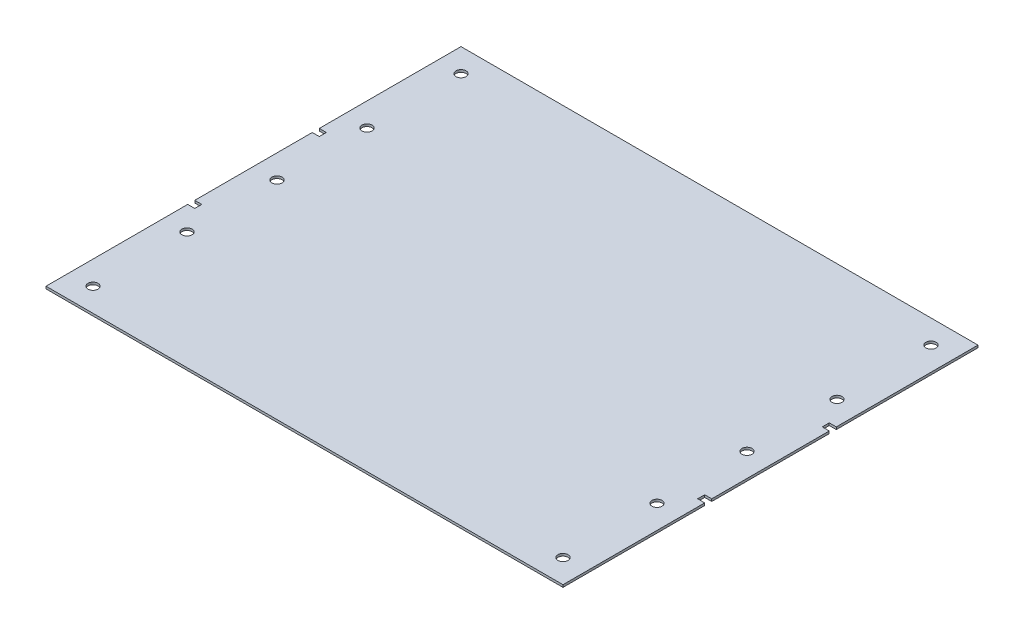
ISO-10303-21;
HEADER;
FILE_DESCRIPTION(('STEP AP214'),'2;1');
FILE_NAME('part.step','',(''),(''),'','','');
FILE_SCHEMA(('AUTOMOTIVE_DESIGN { 1 0 10303 214 1 1 1 1 }'));
ENDSEC;
DATA;
#1=APPLICATION_CONTEXT('core data for automotive mechanical design processes');
#2=APPLICATION_PROTOCOL_DEFINITION('international standard','automotive_design',2000,#1);
#3=PRODUCT_CONTEXT('',#1,'mechanical');
#4=PRODUCT('Part','Part','',(#3));
#5=PRODUCT_RELATED_PRODUCT_CATEGORY('part','',(#4));
#6=PRODUCT_DEFINITION_FORMATION('','',#4);
#7=PRODUCT_DEFINITION_CONTEXT('part definition',#1,'design');
#8=PRODUCT_DEFINITION('design','',#6,#7);
#9=PRODUCT_DEFINITION_SHAPE('','',#8);
#10=(LENGTH_UNIT() NAMED_UNIT(*) SI_UNIT(.MILLI.,.METRE.));
#11=(NAMED_UNIT(*) PLANE_ANGLE_UNIT() SI_UNIT($,.RADIAN.));
#12=(NAMED_UNIT(*) SI_UNIT($,.STERADIAN.) SOLID_ANGLE_UNIT());
#13=UNCERTAINTY_MEASURE_WITH_UNIT(LENGTH_MEASURE(1.E-05),#10,'distance_accuracy_value','');
#14=(GEOMETRIC_REPRESENTATION_CONTEXT(3) GLOBAL_UNCERTAINTY_ASSIGNED_CONTEXT((#13)) GLOBAL_UNIT_ASSIGNED_CONTEXT((#10,
#11,#12)) REPRESENTATION_CONTEXT('',''));
#15=CARTESIAN_POINT('',(0.,0.,0.));
#16=DIRECTION('',(0.,0.,1.));
#17=DIRECTION('',(1.,0.,0.));
#18=AXIS2_PLACEMENT_3D('',#15,#16,#17);
#19=CARTESIAN_POINT('',(207.,1.,0.));
#20=DIRECTION('',(1.,0.,0.));
#21=DIRECTION('',(0.,0.,-1.));
#22=AXIS2_PLACEMENT_3D('',#19,#20,#21);
#23=PLANE('',#22);
#24=DIRECTION('',(0.,0.,1.));
#25=VECTOR('',#24,1.);
#26=CARTESIAN_POINT('',(207.,0.,0.));
#27=LINE('',#26,#25);
#28=CARTESIAN_POINT('',(207.,0.,24.9999999999999));
#29=VERTEX_POINT('',#28);
#30=CARTESIAN_POINT('',(207.,0.,28.));
#31=VERTEX_POINT('',#30);
#32=EDGE_CURVE('E252',#29,#31,#27,.T.);
#33=ORIENTED_EDGE('',*,*,#32,.F.);
#34=DIRECTION('',(0.,-1.,0.));
#35=VECTOR('',#34,1.);
#36=CARTESIAN_POINT('',(207.,1.,24.9999999999999));
#37=LINE('',#36,#35);
#38=CARTESIAN_POINT('',(207.,1.,24.9999999999999));
#39=VERTEX_POINT('',#38);
#40=EDGE_CURVE('E11',#39,#29,#37,.T.);
#41=ORIENTED_EDGE('',*,*,#40,.F.);
#42=DIRECTION('',(0.,0.,1.));
#43=VECTOR('',#42,1.);
#44=CARTESIAN_POINT('',(207.,1.,0.));
#45=LINE('',#44,#43);
#46=CARTESIAN_POINT('',(207.,1.,28.));
#47=VERTEX_POINT('',#46);
#48=EDGE_CURVE('E741',#39,#47,#45,.T.);
#49=ORIENTED_EDGE('',*,*,#48,.T.);
#50=DIRECTION('',(0.,-1.,0.));
#51=VECTOR('',#50,1.);
#52=CARTESIAN_POINT('',(207.,1.,28.));
#53=LINE('',#52,#51);
#54=EDGE_CURVE('E54',#47,#31,#53,.T.);
#55=ORIENTED_EDGE('',*,*,#54,.T.);
#56=EDGE_LOOP('',(#33,#41,#49,#55));
#57=FACE_BOUND('',#56,.T.);
#58=ADVANCED_FACE('F37',(#57),#23,.T.);
#59=CARTESIAN_POINT('',(0.,1.,24.9999999999999));
#60=DIRECTION('',(0.,0.,1.));
#61=DIRECTION('',(1.,0.,0.));
#62=AXIS2_PLACEMENT_3D('',#59,#60,#61);
#63=PLANE('',#62);
#64=DIRECTION('',(-1.,0.,0.));
#65=VECTOR('',#64,1.);
#66=CARTESIAN_POINT('',(0.,0.,24.9999999999999));
#67=LINE('',#66,#65);
#68=CARTESIAN_POINT('',(210.,0.,24.9999999999999));
#69=VERTEX_POINT('',#68);
#70=EDGE_CURVE('E249',#69,#29,#67,.T.);
#71=ORIENTED_EDGE('',*,*,#70,.F.);
#72=DIRECTION('',(0.,-1.,0.));
#73=VECTOR('',#72,1.);
#74=CARTESIAN_POINT('',(210.,1.,24.9999999999999));
#75=LINE('',#74,#73);
#76=CARTESIAN_POINT('',(210.,1.,24.9999999999999));
#77=VERTEX_POINT('',#76);
#78=EDGE_CURVE('E46',#77,#69,#75,.T.);
#79=ORIENTED_EDGE('',*,*,#78,.F.);
#80=DIRECTION('',(-1.,0.,0.));
#81=VECTOR('',#80,1.);
#82=CARTESIAN_POINT('',(0.,1.,24.9999999999999));
#83=LINE('',#82,#81);
#84=EDGE_CURVE('E739',#77,#39,#83,.T.);
#85=ORIENTED_EDGE('',*,*,#84,.T.);
#86=ORIENTED_EDGE('',*,*,#40,.T.);
#87=EDGE_LOOP('',(#71,#79,#85,#86));
#88=FACE_BOUND('',#87,.T.);
#89=ADVANCED_FACE('F250',(#88),#63,.T.);
#90=CARTESIAN_POINT('',(210.,1.,0.));
#91=DIRECTION('',(1.,0.,0.));
#92=DIRECTION('',(0.,0.,-1.));
#93=AXIS2_PLACEMENT_3D('',#90,#91,#92);
#94=PLANE('',#93);
#95=DIRECTION('',(0.,0.,1.));
#96=VECTOR('',#95,1.);
#97=CARTESIAN_POINT('',(210.,0.,0.));
#98=LINE('',#97,#96);
#99=CARTESIAN_POINT('',(210.,0.,-25.));
#100=VERTEX_POINT('',#99);
#101=EDGE_CURVE('E241',#100,#69,#98,.T.);
#102=ORIENTED_EDGE('',*,*,#101,.F.);
#103=DIRECTION('',(0.,-1.,0.));
#104=VECTOR('',#103,1.);
#105=CARTESIAN_POINT('',(210.,1.,-25.));
#106=LINE('',#105,#104);
#107=CARTESIAN_POINT('',(210.,1.,-25.));
#108=VERTEX_POINT('',#107);
#109=EDGE_CURVE('E234',#108,#100,#106,.T.);
#110=ORIENTED_EDGE('',*,*,#109,.F.);
#111=DIRECTION('',(0.,0.,1.));
#112=VECTOR('',#111,1.);
#113=CARTESIAN_POINT('',(210.,1.,0.));
#114=LINE('',#113,#112);
#115=EDGE_CURVE('E244',#108,#77,#114,.T.);
#116=ORIENTED_EDGE('',*,*,#115,.T.);
#117=ORIENTED_EDGE('',*,*,#78,.T.);
#118=EDGE_LOOP('',(#102,#110,#116,#117));
#119=FACE_BOUND('',#118,.T.);
#120=ADVANCED_FACE('F239',(#119),#94,.T.);
#121=CARTESIAN_POINT('',(0.,1.,-25.));
#122=DIRECTION('',(0.,0.,-1.));
#123=DIRECTION('',(-1.,0.,0.));
#124=AXIS2_PLACEMENT_3D('',#121,#122,#123);
#125=PLANE('',#124);
#126=DIRECTION('',(1.,0.,0.));
#127=VECTOR('',#126,1.);
#128=CARTESIAN_POINT('',(0.,0.,-25.));
#129=LINE('',#128,#127);
#130=CARTESIAN_POINT('',(207.,0.,-25.));
#131=VERTEX_POINT('',#130);
#132=EDGE_CURVE('E257',#131,#100,#129,.T.);
#133=ORIENTED_EDGE('',*,*,#132,.F.);
#134=DIRECTION('',(0.,-1.,0.));
#135=VECTOR('',#134,1.);
#136=CARTESIAN_POINT('',(207.,1.,-25.));
#137=LINE('',#136,#135);
#138=CARTESIAN_POINT('',(207.,1.,-25.));
#139=VERTEX_POINT('',#138);
#140=EDGE_CURVE('E232',#139,#131,#137,.T.);
#141=ORIENTED_EDGE('',*,*,#140,.F.);
#142=DIRECTION('',(1.,0.,0.));
#143=VECTOR('',#142,1.);
#144=CARTESIAN_POINT('',(0.,1.,-25.));
#145=LINE('',#144,#143);
#146=EDGE_CURVE('E686',#139,#108,#145,.T.);
#147=ORIENTED_EDGE('',*,*,#146,.T.);
#148=ORIENTED_EDGE('',*,*,#109,.T.);
#149=EDGE_LOOP('',(#133,#141,#147,#148));
#150=FACE_BOUND('',#149,.T.);
#151=ADVANCED_FACE('F645',(#150),#125,.T.);
#152=CARTESIAN_POINT('',(207.,1.,0.));
#153=DIRECTION('',(1.,0.,0.));
#154=DIRECTION('',(0.,0.,-1.));
#155=AXIS2_PLACEMENT_3D('',#152,#153,#154);
#156=PLANE('',#155);
#157=DIRECTION('',(0.,0.,1.));
#158=VECTOR('',#157,1.);
#159=CARTESIAN_POINT('',(207.,0.,0.));
#160=LINE('',#159,#158);
#161=CARTESIAN_POINT('',(207.,0.,-28.));
#162=VERTEX_POINT('',#161);
#163=EDGE_CURVE('E259',#162,#131,#160,.T.);
#164=ORIENTED_EDGE('',*,*,#163,.F.);
#165=DIRECTION('',(0.,-1.,0.));
#166=VECTOR('',#165,1.);
#167=CARTESIAN_POINT('',(207.,1.,-28.));
#168=LINE('',#167,#166);
#169=CARTESIAN_POINT('',(207.,1.,-28.));
#170=VERTEX_POINT('',#169);
#171=EDGE_CURVE('E230',#170,#162,#168,.T.);
#172=ORIENTED_EDGE('',*,*,#171,.F.);
#173=DIRECTION('',(0.,0.,1.));
#174=VECTOR('',#173,1.);
#175=CARTESIAN_POINT('',(207.,1.,0.));
#176=LINE('',#175,#174);
#177=EDGE_CURVE('E682',#170,#139,#176,.T.);
#178=ORIENTED_EDGE('',*,*,#177,.T.);
#179=ORIENTED_EDGE('',*,*,#140,.T.);
#180=EDGE_LOOP('',(#164,#172,#178,#179));
#181=FACE_BOUND('',#180,.T.);
#182=ADVANCED_FACE('F635',(#181),#156,.T.);
#183=CARTESIAN_POINT('',(-2.59052039079188E-13,1.,-27.9999999999981));
#184=DIRECTION('',(0.,0.,1.));
#185=DIRECTION('',(1.,0.,0.));
#186=AXIS2_PLACEMENT_3D('',#183,#184,#185);
#187=PLANE('',#186);
#188=DIRECTION('',(-1.,0.,0.));
#189=VECTOR('',#188,1.);
#190=CARTESIAN_POINT('',(-2.59052039079188E-13,0.,-27.9999999999981));
#191=LINE('',#190,#189);
#192=CARTESIAN_POINT('',(210.,0.,-28.0000000000001));
#193=VERTEX_POINT('',#192);
#194=EDGE_CURVE('E264',#193,#162,#191,.T.);
#195=ORIENTED_EDGE('',*,*,#194,.F.);
#196=DIRECTION('',(0.,-1.,0.));
#197=VECTOR('',#196,1.);
#198=CARTESIAN_POINT('',(210.,1.,-28.0000000000001));
#199=LINE('',#198,#197);
#200=CARTESIAN_POINT('',(210.,1.,-28.0000000000001));
#201=VERTEX_POINT('',#200);
#202=EDGE_CURVE('E228',#201,#193,#199,.T.);
#203=ORIENTED_EDGE('',*,*,#202,.F.);
#204=DIRECTION('',(-1.,0.,0.));
#205=VECTOR('',#204,1.);
#206=CARTESIAN_POINT('',(-2.59052039079188E-13,1.,-27.9999999999981));
#207=LINE('',#206,#205);
#208=EDGE_CURVE('E685',#201,#170,#207,.T.);
#209=ORIENTED_EDGE('',*,*,#208,.T.);
#210=ORIENTED_EDGE('',*,*,#171,.T.);
#211=EDGE_LOOP('',(#195,#203,#209,#210));
#212=FACE_BOUND('',#211,.T.);
#213=ADVANCED_FACE('F625',(#212),#187,.T.);
#214=CARTESIAN_POINT('',(210.,1.,0.));
#215=DIRECTION('',(1.,0.,0.));
#216=DIRECTION('',(0.,0.,-1.));
#217=AXIS2_PLACEMENT_3D('',#214,#215,#216);
#218=PLANE('',#217);
#219=DIRECTION('',(0.,0.,1.));
#220=VECTOR('',#219,1.);
#221=CARTESIAN_POINT('',(210.,0.,0.));
#222=LINE('',#221,#220);
#223=CARTESIAN_POINT('',(210.,0.,-88.3000000000001));
#224=VERTEX_POINT('',#223);
#225=EDGE_CURVE('E267',#224,#193,#222,.T.);
#226=ORIENTED_EDGE('',*,*,#225,.F.);
#227=DIRECTION('',(0.,-1.,0.));
#228=VECTOR('',#227,1.);
#229=CARTESIAN_POINT('',(210.,1.,-88.3000000000001));
#230=LINE('',#229,#228);
#231=CARTESIAN_POINT('',(210.,1.,-88.3000000000001));
#232=VERTEX_POINT('',#231);
#233=EDGE_CURVE('E226',#232,#224,#230,.T.);
#234=ORIENTED_EDGE('',*,*,#233,.F.);
#235=DIRECTION('',(0.,0.,1.));
#236=VECTOR('',#235,1.);
#237=CARTESIAN_POINT('',(210.,1.,0.));
#238=LINE('',#237,#236);
#239=EDGE_CURVE('E688',#232,#201,#238,.T.);
#240=ORIENTED_EDGE('',*,*,#239,.T.);
#241=ORIENTED_EDGE('',*,*,#202,.T.);
#242=EDGE_LOOP('',(#226,#234,#240,#241));
#243=FACE_BOUND('',#242,.T.);
#244=ADVANCED_FACE('F615',(#243),#218,.T.);
#245=CARTESIAN_POINT('',(0.,1.,-88.3));
#246=DIRECTION('',(0.,0.,-1.));
#247=DIRECTION('',(-1.,0.,0.));
#248=AXIS2_PLACEMENT_3D('',#245,#246,#247);
#249=PLANE('',#248);
#250=DIRECTION('',(1.,0.,0.));
#251=VECTOR('',#250,1.);
#252=CARTESIAN_POINT('',(0.,0.,-88.3));
#253=LINE('',#252,#251);
#254=CARTESIAN_POINT('',(-10.,0.,-88.3));
#255=VERTEX_POINT('',#254);
#256=EDGE_CURVE('E270',#255,#224,#253,.T.);
#257=ORIENTED_EDGE('',*,*,#256,.F.);
#258=DIRECTION('',(0.,-1.,0.));
#259=VECTOR('',#258,1.);
#260=CARTESIAN_POINT('',(-10.,1.,-88.3));
#261=LINE('',#260,#259);
#262=CARTESIAN_POINT('',(-10.,1.,-88.3));
#263=VERTEX_POINT('',#262);
#264=EDGE_CURVE('E224',#263,#255,#261,.T.);
#265=ORIENTED_EDGE('',*,*,#264,.F.);
#266=DIRECTION('',(1.,0.,0.));
#267=VECTOR('',#266,1.);
#268=CARTESIAN_POINT('',(0.,1.,-88.3));
#269=LINE('',#268,#267);
#270=EDGE_CURVE('E695',#263,#232,#269,.T.);
#271=ORIENTED_EDGE('',*,*,#270,.T.);
#272=ORIENTED_EDGE('',*,*,#233,.T.);
#273=EDGE_LOOP('',(#257,#265,#271,#272));
#274=FACE_BOUND('',#273,.T.);
#275=ADVANCED_FACE('F605',(#274),#249,.T.);
#276=CARTESIAN_POINT('',(-9.99999999999995,1.,0.));
#277=DIRECTION('',(-1.,0.,0.));
#278=DIRECTION('',(0.,0.,1.));
#279=AXIS2_PLACEMENT_3D('',#276,#277,#278);
#280=PLANE('',#279);
#281=DIRECTION('',(0.,0.,-1.));
#282=VECTOR('',#281,1.);
#283=CARTESIAN_POINT('',(-9.99999999999995,0.,0.));
#284=LINE('',#283,#282);
#285=CARTESIAN_POINT('',(-9.99999999999997,0.,-28.));
#286=VERTEX_POINT('',#285);
#287=EDGE_CURVE('E273',#286,#255,#284,.T.);
#288=ORIENTED_EDGE('',*,*,#287,.F.);
#289=DIRECTION('',(0.,-1.,0.));
#290=VECTOR('',#289,1.);
#291=CARTESIAN_POINT('',(-9.99999999999997,1.,-28.));
#292=LINE('',#291,#290);
#293=CARTESIAN_POINT('',(-9.99999999999997,1.,-28.));
#294=VERTEX_POINT('',#293);
#295=EDGE_CURVE('E222',#294,#286,#292,.T.);
#296=ORIENTED_EDGE('',*,*,#295,.F.);
#297=DIRECTION('',(0.,0.,-1.));
#298=VECTOR('',#297,1.);
#299=CARTESIAN_POINT('',(-9.99999999999995,1.,0.));
#300=LINE('',#299,#298);
#301=EDGE_CURVE('E698',#294,#263,#300,.T.);
#302=ORIENTED_EDGE('',*,*,#301,.T.);
#303=ORIENTED_EDGE('',*,*,#264,.T.);
#304=EDGE_LOOP('',(#288,#296,#302,#303));
#305=FACE_BOUND('',#304,.T.);
#306=ADVANCED_FACE('F595',(#305),#280,.T.);
#307=CARTESIAN_POINT('',(0.,1.,-28.));
#308=DIRECTION('',(0.,0.,1.));
#309=DIRECTION('',(1.,0.,0.));
#310=AXIS2_PLACEMENT_3D('',#307,#308,#309);
#311=PLANE('',#310);
#312=DIRECTION('',(-1.,0.,0.));
#313=VECTOR('',#312,1.);
#314=CARTESIAN_POINT('',(0.,0.,-28.));
#315=LINE('',#314,#313);
#316=CARTESIAN_POINT('',(-6.99999999999998,0.,-28.));
#317=VERTEX_POINT('',#316);
#318=EDGE_CURVE('E276',#317,#286,#315,.T.);
#319=ORIENTED_EDGE('',*,*,#318,.F.);
#320=DIRECTION('',(0.,-1.,0.));
#321=VECTOR('',#320,1.);
#322=CARTESIAN_POINT('',(-6.99999999999998,1.,-28.));
#323=LINE('',#322,#321);
#324=CARTESIAN_POINT('',(-6.99999999999998,1.,-28.));
#325=VERTEX_POINT('',#324);
#326=EDGE_CURVE('E220',#325,#317,#323,.T.);
#327=ORIENTED_EDGE('',*,*,#326,.F.);
#328=DIRECTION('',(-1.,0.,0.));
#329=VECTOR('',#328,1.);
#330=CARTESIAN_POINT('',(0.,1.,-28.));
#331=LINE('',#330,#329);
#332=EDGE_CURVE('E701',#325,#294,#331,.T.);
#333=ORIENTED_EDGE('',*,*,#332,.T.);
#334=ORIENTED_EDGE('',*,*,#295,.T.);
#335=EDGE_LOOP('',(#319,#327,#333,#334));
#336=FACE_BOUND('',#335,.T.);
#337=ADVANCED_FACE('F585',(#336),#311,.T.);
#338=CARTESIAN_POINT('',(-6.99999999999975,1.,0.));
#339=DIRECTION('',(1.,0.,0.));
#340=DIRECTION('',(0.,0.,-1.));
#341=AXIS2_PLACEMENT_3D('',#338,#339,#340);
#342=PLANE('',#341);
#343=DIRECTION('',(0.,0.,1.));
#344=VECTOR('',#343,1.);
#345=CARTESIAN_POINT('',(-6.99999999999975,0.,0.));
#346=LINE('',#345,#344);
#347=CARTESIAN_POINT('',(-6.99999999999996,0.,-25.));
#348=VERTEX_POINT('',#347);
#349=EDGE_CURVE('E279',#317,#348,#346,.T.);
#350=ORIENTED_EDGE('',*,*,#349,.T.);
#351=DIRECTION('',(0.,-1.,0.));
#352=VECTOR('',#351,1.);
#353=CARTESIAN_POINT('',(-6.99999999999996,1.,-25.));
#354=LINE('',#353,#352);
#355=CARTESIAN_POINT('',(-6.99999999999996,1.,-25.));
#356=VERTEX_POINT('',#355);
#357=EDGE_CURVE('E217',#356,#348,#354,.T.);
#358=ORIENTED_EDGE('',*,*,#357,.F.);
#359=DIRECTION('',(0.,0.,1.));
#360=VECTOR('',#359,1.);
#361=CARTESIAN_POINT('',(-6.99999999999975,1.,0.));
#362=LINE('',#361,#360);
#363=EDGE_CURVE('E704',#325,#356,#362,.T.);
#364=ORIENTED_EDGE('',*,*,#363,.F.);
#365=ORIENTED_EDGE('',*,*,#326,.T.);
#366=EDGE_LOOP('',(#350,#358,#364,#365));
#367=FACE_BOUND('',#366,.T.);
#368=ADVANCED_FACE('F575',(#367),#342,.F.);
#369=CARTESIAN_POINT('',(0.,1.,-25.));
#370=DIRECTION('',(0.,0.,1.));
#371=DIRECTION('',(1.,0.,0.));
#372=AXIS2_PLACEMENT_3D('',#369,#370,#371);
#373=PLANE('',#372);
#374=DIRECTION('',(-1.,0.,0.));
#375=VECTOR('',#374,1.);
#376=CARTESIAN_POINT('',(0.,0.,-25.));
#377=LINE('',#376,#375);
#378=CARTESIAN_POINT('',(-9.99999999999999,0.,-25.));
#379=VERTEX_POINT('',#378);
#380=EDGE_CURVE('E282',#348,#379,#377,.T.);
#381=ORIENTED_EDGE('',*,*,#380,.T.);
#382=DIRECTION('',(0.,-1.,0.));
#383=VECTOR('',#382,1.);
#384=CARTESIAN_POINT('',(-9.99999999999999,1.,-25.));
#385=LINE('',#384,#383);
#386=CARTESIAN_POINT('',(-9.99999999999999,1.,-25.));
#387=VERTEX_POINT('',#386);
#388=EDGE_CURVE('E214',#387,#379,#385,.T.);
#389=ORIENTED_EDGE('',*,*,#388,.F.);
#390=DIRECTION('',(-1.,0.,0.));
#391=VECTOR('',#390,1.);
#392=CARTESIAN_POINT('',(0.,1.,-25.));
#393=LINE('',#392,#391);
#394=EDGE_CURVE('E707',#356,#387,#393,.T.);
#395=ORIENTED_EDGE('',*,*,#394,.F.);
#396=ORIENTED_EDGE('',*,*,#357,.T.);
#397=EDGE_LOOP('',(#381,#389,#395,#396));
#398=FACE_BOUND('',#397,.T.);
#399=ADVANCED_FACE('F565',(#398),#373,.F.);
#400=CARTESIAN_POINT('',(-9.99999999999999,1.,0.));
#401=DIRECTION('',(1.,0.,0.));
#402=DIRECTION('',(0.,0.,-1.));
#403=AXIS2_PLACEMENT_3D('',#400,#401,#402);
#404=PLANE('',#403);
#405=DIRECTION('',(0.,0.,1.));
#406=VECTOR('',#405,1.);
#407=CARTESIAN_POINT('',(-9.99999999999999,0.,0.));
#408=LINE('',#407,#406);
#409=CARTESIAN_POINT('',(-9.99999999999999,0.,25.));
#410=VERTEX_POINT('',#409);
#411=EDGE_CURVE('E285',#379,#410,#408,.T.);
#412=ORIENTED_EDGE('',*,*,#411,.T.);
#413=DIRECTION('',(0.,-1.,0.));
#414=VECTOR('',#413,1.);
#415=CARTESIAN_POINT('',(-9.99999999999999,1.,25.));
#416=LINE('',#415,#414);
#417=CARTESIAN_POINT('',(-9.99999999999999,1.,25.));
#418=VERTEX_POINT('',#417);
#419=EDGE_CURVE('E211',#418,#410,#416,.T.);
#420=ORIENTED_EDGE('',*,*,#419,.F.);
#421=DIRECTION('',(0.,0.,1.));
#422=VECTOR('',#421,1.);
#423=CARTESIAN_POINT('',(-9.99999999999999,1.,0.));
#424=LINE('',#423,#422);
#425=EDGE_CURVE('E710',#387,#418,#424,.T.);
#426=ORIENTED_EDGE('',*,*,#425,.F.);
#427=ORIENTED_EDGE('',*,*,#388,.T.);
#428=EDGE_LOOP('',(#412,#420,#426,#427));
#429=FACE_BOUND('',#428,.T.);
#430=ADVANCED_FACE('F555',(#429),#404,.F.);
#431=CARTESIAN_POINT('',(0.,1.,25.));
#432=DIRECTION('',(0.,0.,-1.));
#433=DIRECTION('',(-1.,0.,0.));
#434=AXIS2_PLACEMENT_3D('',#431,#432,#433);
#435=PLANE('',#434);
#436=DIRECTION('',(1.,0.,0.));
#437=VECTOR('',#436,1.);
#438=CARTESIAN_POINT('',(0.,0.,25.));
#439=LINE('',#438,#437);
#440=CARTESIAN_POINT('',(-6.99999999999997,0.,25.));
#441=VERTEX_POINT('',#440);
#442=EDGE_CURVE('E288',#410,#441,#439,.T.);
#443=ORIENTED_EDGE('',*,*,#442,.T.);
#444=DIRECTION('',(0.,-1.,0.));
#445=VECTOR('',#444,1.);
#446=CARTESIAN_POINT('',(-6.99999999999997,1.,25.));
#447=LINE('',#446,#445);
#448=CARTESIAN_POINT('',(-6.99999999999997,1.,25.));
#449=VERTEX_POINT('',#448);
#450=EDGE_CURVE('E208',#449,#441,#447,.T.);
#451=ORIENTED_EDGE('',*,*,#450,.F.);
#452=DIRECTION('',(1.,0.,0.));
#453=VECTOR('',#452,1.);
#454=CARTESIAN_POINT('',(0.,1.,25.));
#455=LINE('',#454,#453);
#456=EDGE_CURVE('E713',#418,#449,#455,.T.);
#457=ORIENTED_EDGE('',*,*,#456,.F.);
#458=ORIENTED_EDGE('',*,*,#419,.T.);
#459=EDGE_LOOP('',(#443,#451,#457,#458));
#460=FACE_BOUND('',#459,.T.);
#461=ADVANCED_FACE('F545',(#460),#435,.F.);
#462=CARTESIAN_POINT('',(-6.99999999999989,1.,0.));
#463=DIRECTION('',(1.,0.,0.));
#464=DIRECTION('',(0.,0.,-1.));
#465=AXIS2_PLACEMENT_3D('',#462,#463,#464);
#466=PLANE('',#465);
#467=DIRECTION('',(0.,0.,1.));
#468=VECTOR('',#467,1.);
#469=CARTESIAN_POINT('',(-6.99999999999989,0.,0.));
#470=LINE('',#469,#468);
#471=CARTESIAN_POINT('',(-6.99999999999998,0.,28.));
#472=VERTEX_POINT('',#471);
#473=EDGE_CURVE('E291',#441,#472,#470,.T.);
#474=ORIENTED_EDGE('',*,*,#473,.T.);
#475=DIRECTION('',(0.,-1.,0.));
#476=VECTOR('',#475,1.);
#477=CARTESIAN_POINT('',(-6.99999999999998,1.,28.));
#478=LINE('',#477,#476);
#479=CARTESIAN_POINT('',(-6.99999999999998,1.,28.));
#480=VERTEX_POINT('',#479);
#481=EDGE_CURVE('E206',#480,#472,#478,.T.);
#482=ORIENTED_EDGE('',*,*,#481,.F.);
#483=DIRECTION('',(0.,0.,1.));
#484=VECTOR('',#483,1.);
#485=CARTESIAN_POINT('',(-6.99999999999989,1.,0.));
#486=LINE('',#485,#484);
#487=EDGE_CURVE('E716',#449,#480,#486,.T.);
#488=ORIENTED_EDGE('',*,*,#487,.F.);
#489=ORIENTED_EDGE('',*,*,#450,.T.);
#490=EDGE_LOOP('',(#474,#482,#488,#489));
#491=FACE_BOUND('',#490,.T.);
#492=ADVANCED_FACE('F535',(#491),#466,.F.);
#493=CARTESIAN_POINT('',(0.,1.,28.));
#494=DIRECTION('',(0.,0.,-1.));
#495=DIRECTION('',(-1.,0.,0.));
#496=AXIS2_PLACEMENT_3D('',#493,#494,#495);
#497=PLANE('',#496);
#498=DIRECTION('',(1.,0.,0.));
#499=VECTOR('',#498,1.);
#500=CARTESIAN_POINT('',(0.,0.,28.));
#501=LINE('',#500,#499);
#502=CARTESIAN_POINT('',(-9.99999999999998,0.,28.));
#503=VERTEX_POINT('',#502);
#504=EDGE_CURVE('E294',#503,#472,#501,.T.);
#505=ORIENTED_EDGE('',*,*,#504,.F.);
#506=DIRECTION('',(0.,-1.,0.));
#507=VECTOR('',#506,1.);
#508=CARTESIAN_POINT('',(-9.99999999999998,1.,28.));
#509=LINE('',#508,#507);
#510=CARTESIAN_POINT('',(-9.99999999999998,1.,28.));
#511=VERTEX_POINT('',#510);
#512=EDGE_CURVE('E200',#511,#503,#509,.T.);
#513=ORIENTED_EDGE('',*,*,#512,.F.);
#514=DIRECTION('',(1.,0.,0.));
#515=VECTOR('',#514,1.);
#516=CARTESIAN_POINT('',(0.,1.,28.));
#517=LINE('',#516,#515);
#518=EDGE_CURVE('E718',#511,#480,#517,.T.);
#519=ORIENTED_EDGE('',*,*,#518,.T.);
#520=ORIENTED_EDGE('',*,*,#481,.T.);
#521=EDGE_LOOP('',(#505,#513,#519,#520));
#522=FACE_BOUND('',#521,.T.);
#523=ADVANCED_FACE('F525',(#522),#497,.T.);
#524=CARTESIAN_POINT('',(-9.99999999999998,1.,0.));
#525=DIRECTION('',(1.,0.,0.));
#526=DIRECTION('',(0.,0.,-1.));
#527=AXIS2_PLACEMENT_3D('',#524,#525,#526);
#528=PLANE('',#527);
#529=DIRECTION('',(0.,0.,1.));
#530=VECTOR('',#529,1.);
#531=CARTESIAN_POINT('',(-9.99999999999998,0.,0.));
#532=LINE('',#531,#530);
#533=CARTESIAN_POINT('',(-9.99999999999998,0.,88.3));
#534=VERTEX_POINT('',#533);
#535=EDGE_CURVE('E297',#503,#534,#532,.T.);
#536=ORIENTED_EDGE('',*,*,#535,.T.);
#537=DIRECTION('',(0.,-1.,0.));
#538=VECTOR('',#537,1.);
#539=CARTESIAN_POINT('',(-9.99999999999998,1.,88.3));
#540=LINE('',#539,#538);
#541=CARTESIAN_POINT('',(-9.99999999999998,1.,88.3));
#542=VERTEX_POINT('',#541);
#543=EDGE_CURVE('E198',#542,#534,#540,.T.);
#544=ORIENTED_EDGE('',*,*,#543,.F.);
#545=DIRECTION('',(0.,0.,1.));
#546=VECTOR('',#545,1.);
#547=CARTESIAN_POINT('',(-9.99999999999998,1.,0.));
#548=LINE('',#547,#546);
#549=EDGE_CURVE('E191',#511,#542,#548,.T.);
#550=ORIENTED_EDGE('',*,*,#549,.F.);
#551=ORIENTED_EDGE('',*,*,#512,.T.);
#552=EDGE_LOOP('',(#536,#544,#550,#551));
#553=FACE_BOUND('',#552,.T.);
#554=ADVANCED_FACE('F516',(#553),#528,.F.);
#555=CARTESIAN_POINT('',(0.,1.,88.3));
#556=DIRECTION('',(0.,0.,-1.));
#557=DIRECTION('',(-1.,0.,0.));
#558=AXIS2_PLACEMENT_3D('',#555,#556,#557);
#559=PLANE('',#558);
#560=DIRECTION('',(1.,0.,0.));
#561=VECTOR('',#560,1.);
#562=CARTESIAN_POINT('',(0.,0.,88.3));
#563=LINE('',#562,#561);
#564=CARTESIAN_POINT('',(210.,0.,88.3));
#565=VERTEX_POINT('',#564);
#566=EDGE_CURVE('E197',#534,#565,#563,.T.);
#567=ORIENTED_EDGE('',*,*,#566,.T.);
#568=DIRECTION('',(0.,-1.,0.));
#569=VECTOR('',#568,1.);
#570=CARTESIAN_POINT('',(210.,1.,88.3));
#571=LINE('',#570,#569);
#572=CARTESIAN_POINT('',(210.,1.,88.3));
#573=VERTEX_POINT('',#572);
#574=EDGE_CURVE('E180',#573,#565,#571,.T.);
#575=ORIENTED_EDGE('',*,*,#574,.F.);
#576=DIRECTION('',(1.,0.,0.));
#577=VECTOR('',#576,1.);
#578=CARTESIAN_POINT('',(0.,1.,88.3));
#579=LINE('',#578,#577);
#580=EDGE_CURVE('E185',#542,#573,#579,.T.);
#581=ORIENTED_EDGE('',*,*,#580,.F.);
#582=ORIENTED_EDGE('',*,*,#543,.T.);
#583=EDGE_LOOP('',(#567,#575,#581,#582));
#584=FACE_BOUND('',#583,.T.);
#585=ADVANCED_FACE('F196',(#584),#559,.F.);
#586=CARTESIAN_POINT('',(210.,1.,0.));
#587=DIRECTION('',(-1.,0.,0.));
#588=DIRECTION('',(0.,0.,1.));
#589=AXIS2_PLACEMENT_3D('',#586,#587,#588);
#590=PLANE('',#589);
#591=DIRECTION('',(0.,0.,-1.));
#592=VECTOR('',#591,1.);
#593=CARTESIAN_POINT('',(210.,0.,0.));
#594=LINE('',#593,#592);
#595=CARTESIAN_POINT('',(210.,0.,28.));
#596=VERTEX_POINT('',#595);
#597=EDGE_CURVE('E301',#565,#596,#594,.T.);
#598=ORIENTED_EDGE('',*,*,#597,.T.);
#599=DIRECTION('',(0.,-1.,0.));
#600=VECTOR('',#599,1.);
#601=CARTESIAN_POINT('',(210.,1.,28.));
#602=LINE('',#601,#600);
#603=CARTESIAN_POINT('',(210.,1.,28.));
#604=VERTEX_POINT('',#603);
#605=EDGE_CURVE('E116',#604,#596,#602,.T.);
#606=ORIENTED_EDGE('',*,*,#605,.F.);
#607=DIRECTION('',(0.,0.,-1.));
#608=VECTOR('',#607,1.);
#609=CARTESIAN_POINT('',(210.,1.,0.));
#610=LINE('',#609,#608);
#611=EDGE_CURVE('E176',#573,#604,#610,.T.);
#612=ORIENTED_EDGE('',*,*,#611,.F.);
#613=ORIENTED_EDGE('',*,*,#574,.T.);
#614=EDGE_LOOP('',(#598,#606,#612,#613));
#615=FACE_BOUND('',#614,.T.);
#616=ADVANCED_FACE('F178',(#615),#590,.F.);
#617=CARTESIAN_POINT('',(0.,1.,38.3));
#618=DIRECTION('',(0.,-1.,0.));
#619=DIRECTION('',(0.,0.,-1.));
#620=AXIS2_PLACEMENT_3D('',#617,#618,#619);
#621=CYLINDRICAL_SURFACE('',#620,2.15);
#622=CARTESIAN_POINT('',(0.,1.,38.3));
#623=DIRECTION('',(0.,1.,0.));
#624=DIRECTION('',(0.,0.,1.));
#625=AXIS2_PLACEMENT_3D('',#622,#623,#624);
#626=CIRCLE('',#625,2.15);
#627=CARTESIAN_POINT('',(0.,1.,40.45));
#628=VERTEX_POINT('',#627);
#629=EDGE_CURVE('E743',#628,#628,#626,.T.);
#630=ORIENTED_EDGE('',*,*,#629,.T.);
#631=EDGE_LOOP('',(#630));
#632=FACE_BOUND('',#631,.T.);
#633=CARTESIAN_POINT('',(0.,0.,38.3));
#634=DIRECTION('',(0.,1.,0.));
#635=DIRECTION('',(0.,0.,1.));
#636=AXIS2_PLACEMENT_3D('',#633,#634,#635);
#637=CIRCLE('',#636,2.15);
#638=CARTESIAN_POINT('',(0.,0.,40.45));
#639=VERTEX_POINT('',#638);
#640=EDGE_CURVE('E335',#639,#639,#637,.T.);
#641=ORIENTED_EDGE('',*,*,#640,.F.);
#642=EDGE_LOOP('',(#641));
#643=FACE_BOUND('',#642,.T.);
#644=ADVANCED_FACE('F358',(#632,#643),#621,.F.);
#645=CARTESIAN_POINT('',(0.,1.,-38.3));
#646=DIRECTION('',(0.,-1.,0.));
#647=DIRECTION('',(0.,0.,-1.));
#648=AXIS2_PLACEMENT_3D('',#645,#646,#647);
#649=CYLINDRICAL_SURFACE('',#648,2.15);
#650=CARTESIAN_POINT('',(0.,1.,-38.3));
#651=DIRECTION('',(0.,1.,0.));
#652=DIRECTION('',(0.,0.,1.));
#653=AXIS2_PLACEMENT_3D('',#650,#651,#652);
#654=CIRCLE('',#653,2.15);
#655=CARTESIAN_POINT('',(0.,1.,-36.15));
#656=VERTEX_POINT('',#655);
#657=EDGE_CURVE('E746',#656,#656,#654,.T.);
#658=ORIENTED_EDGE('',*,*,#657,.T.);
#659=EDGE_LOOP('',(#658));
#660=FACE_BOUND('',#659,.T.);
#661=CARTESIAN_POINT('',(0.,0.,-38.3));
#662=DIRECTION('',(0.,1.,0.));
#663=DIRECTION('',(0.,0.,1.));
#664=AXIS2_PLACEMENT_3D('',#661,#662,#663);
#665=CIRCLE('',#664,2.15);
#666=CARTESIAN_POINT('',(0.,0.,-36.15));
#667=VERTEX_POINT('',#666);
#668=EDGE_CURVE('E332',#667,#667,#665,.T.);
#669=ORIENTED_EDGE('',*,*,#668,.F.);
#670=EDGE_LOOP('',(#669));
#671=FACE_BOUND('',#670,.T.);
#672=ADVANCED_FACE('F361',(#660,#671),#649,.F.);
#673=CARTESIAN_POINT('',(0.,1.,78.3000000000001));
#674=DIRECTION('',(0.,-1.,0.));
#675=DIRECTION('',(0.,0.,-1.));
#676=AXIS2_PLACEMENT_3D('',#673,#674,#675);
#677=CYLINDRICAL_SURFACE('',#676,2.15);
#678=CARTESIAN_POINT('',(0.,1.,78.3000000000001));
#679=DIRECTION('',(0.,1.,0.));
#680=DIRECTION('',(0.,0.,1.));
#681=AXIS2_PLACEMENT_3D('',#678,#679,#680);
#682=CIRCLE('',#681,2.15);
#683=CARTESIAN_POINT('',(0.,1.,80.45));
#684=VERTEX_POINT('',#683);
#685=EDGE_CURVE('E749',#684,#684,#682,.T.);
#686=ORIENTED_EDGE('',*,*,#685,.T.);
#687=EDGE_LOOP('',(#686));
#688=FACE_BOUND('',#687,.T.);
#689=CARTESIAN_POINT('',(0.,0.,78.3000000000001));
#690=DIRECTION('',(0.,1.,0.));
#691=DIRECTION('',(0.,0.,1.));
#692=AXIS2_PLACEMENT_3D('',#689,#690,#691);
#693=CIRCLE('',#692,2.15);
#694=CARTESIAN_POINT('',(0.,0.,80.45));
#695=VERTEX_POINT('',#694);
#696=EDGE_CURVE('E329',#695,#695,#693,.T.);
#697=ORIENTED_EDGE('',*,*,#696,.F.);
#698=EDGE_LOOP('',(#697));
#699=FACE_BOUND('',#698,.T.);
#700=ADVANCED_FACE('F365',(#688,#699),#677,.F.);
#701=CARTESIAN_POINT('',(0.,1.,-78.3000000000001));
#702=DIRECTION('',(0.,-1.,0.));
#703=DIRECTION('',(0.,0.,-1.));
#704=AXIS2_PLACEMENT_3D('',#701,#702,#703);
#705=CYLINDRICAL_SURFACE('',#704,2.15);
#706=CARTESIAN_POINT('',(0.,1.,-78.3000000000001));
#707=DIRECTION('',(0.,1.,0.));
#708=DIRECTION('',(0.,0.,1.));
#709=AXIS2_PLACEMENT_3D('',#706,#707,#708);
#710=CIRCLE('',#709,2.15);
#711=CARTESIAN_POINT('',(0.,1.,-76.15));
#712=VERTEX_POINT('',#711);
#713=EDGE_CURVE('E752',#712,#712,#710,.T.);
#714=ORIENTED_EDGE('',*,*,#713,.T.);
#715=EDGE_LOOP('',(#714));
#716=FACE_BOUND('',#715,.T.);
#717=CARTESIAN_POINT('',(0.,0.,-78.3000000000001));
#718=DIRECTION('',(0.,1.,0.));
#719=DIRECTION('',(0.,0.,1.));
#720=AXIS2_PLACEMENT_3D('',#717,#718,#719);
#721=CIRCLE('',#720,2.15);
#722=CARTESIAN_POINT('',(0.,0.,-76.15));
#723=VERTEX_POINT('',#722);
#724=EDGE_CURVE('E326',#723,#723,#721,.T.);
#725=ORIENTED_EDGE('',*,*,#724,.F.);
#726=EDGE_LOOP('',(#725));
#727=FACE_BOUND('',#726,.T.);
#728=ADVANCED_FACE('F369',(#716,#727),#705,.F.);
#729=CARTESIAN_POINT('',(200.,1.,78.3000000000001));
#730=DIRECTION('',(0.,-1.,0.));
#731=DIRECTION('',(0.,0.,-1.));
#732=AXIS2_PLACEMENT_3D('',#729,#730,#731);
#733=CYLINDRICAL_SURFACE('',#732,2.15000000000001);
#734=CARTESIAN_POINT('',(200.,1.,78.3000000000001));
#735=DIRECTION('',(0.,1.,0.));
#736=DIRECTION('',(0.,0.,1.));
#737=AXIS2_PLACEMENT_3D('',#734,#735,#736);
#738=CIRCLE('',#737,2.15000000000001);
#739=CARTESIAN_POINT('',(200.,1.,80.4500000000001));
#740=VERTEX_POINT('',#739);
#741=EDGE_CURVE('E755',#740,#740,#738,.T.);
#742=ORIENTED_EDGE('',*,*,#741,.T.);
#743=EDGE_LOOP('',(#742));
#744=FACE_BOUND('',#743,.T.);
#745=CARTESIAN_POINT('',(200.,0.,78.3000000000001));
#746=DIRECTION('',(0.,1.,0.));
#747=DIRECTION('',(0.,0.,1.));
#748=AXIS2_PLACEMENT_3D('',#745,#746,#747);
#749=CIRCLE('',#748,2.15000000000001);
#750=CARTESIAN_POINT('',(200.,0.,80.4500000000001));
#751=VERTEX_POINT('',#750);
#752=EDGE_CURVE('E323',#751,#751,#749,.T.);
#753=ORIENTED_EDGE('',*,*,#752,.F.);
#754=EDGE_LOOP('',(#753));
#755=FACE_BOUND('',#754,.T.);
#756=ADVANCED_FACE('F373',(#744,#755),#733,.F.);
#757=CARTESIAN_POINT('',(200.,1.,38.3));
#758=DIRECTION('',(0.,-1.,0.));
#759=DIRECTION('',(0.,0.,-1.));
#760=AXIS2_PLACEMENT_3D('',#757,#758,#759);
#761=CYLINDRICAL_SURFACE('',#760,2.15000000000002);
#762=CARTESIAN_POINT('',(200.,1.,38.3));
#763=DIRECTION('',(0.,1.,0.));
#764=DIRECTION('',(0.,0.,1.));
#765=AXIS2_PLACEMENT_3D('',#762,#763,#764);
#766=CIRCLE('',#765,2.15000000000002);
#767=CARTESIAN_POINT('',(200.,1.,40.4500000000001));
#768=VERTEX_POINT('',#767);
#769=EDGE_CURVE('E758',#768,#768,#766,.T.);
#770=ORIENTED_EDGE('',*,*,#769,.T.);
#771=EDGE_LOOP('',(#770));
#772=FACE_BOUND('',#771,.T.);
#773=CARTESIAN_POINT('',(200.,0.,38.3));
#774=DIRECTION('',(0.,1.,0.));
#775=DIRECTION('',(0.,0.,1.));
#776=AXIS2_PLACEMENT_3D('',#773,#774,#775);
#777=CIRCLE('',#776,2.15000000000002);
#778=CARTESIAN_POINT('',(200.,0.,40.4500000000001));
#779=VERTEX_POINT('',#778);
#780=EDGE_CURVE('E320',#779,#779,#777,.T.);
#781=ORIENTED_EDGE('',*,*,#780,.F.);
#782=EDGE_LOOP('',(#781));
#783=FACE_BOUND('',#782,.T.);
#784=ADVANCED_FACE('F377',(#772,#783),#761,.F.);
#785=CARTESIAN_POINT('',(200.,1.,-38.3));
#786=DIRECTION('',(0.,-1.,0.));
#787=DIRECTION('',(0.,0.,-1.));
#788=AXIS2_PLACEMENT_3D('',#785,#786,#787);
#789=CYLINDRICAL_SURFACE('',#788,2.15000000000002);
#790=CARTESIAN_POINT('',(200.,1.,-38.3));
#791=DIRECTION('',(0.,1.,0.));
#792=DIRECTION('',(0.,0.,1.));
#793=AXIS2_PLACEMENT_3D('',#790,#791,#792);
#794=CIRCLE('',#793,2.15000000000002);
#795=CARTESIAN_POINT('',(200.,1.,-36.15));
#796=VERTEX_POINT('',#795);
#797=EDGE_CURVE('E761',#796,#796,#794,.T.);
#798=ORIENTED_EDGE('',*,*,#797,.T.);
#799=EDGE_LOOP('',(#798));
#800=FACE_BOUND('',#799,.T.);
#801=CARTESIAN_POINT('',(200.,0.,-38.3));
#802=DIRECTION('',(0.,1.,0.));
#803=DIRECTION('',(0.,0.,1.));
#804=AXIS2_PLACEMENT_3D('',#801,#802,#803);
#805=CIRCLE('',#804,2.15000000000002);
#806=CARTESIAN_POINT('',(200.,0.,-36.15));
#807=VERTEX_POINT('',#806);
#808=EDGE_CURVE('E317',#807,#807,#805,.T.);
#809=ORIENTED_EDGE('',*,*,#808,.F.);
#810=EDGE_LOOP('',(#809));
#811=FACE_BOUND('',#810,.T.);
#812=ADVANCED_FACE('F381',(#800,#811),#789,.F.);
#813=CARTESIAN_POINT('',(200.,1.,-78.3000000000001));
#814=DIRECTION('',(0.,-1.,0.));
#815=DIRECTION('',(0.,0.,-1.));
#816=AXIS2_PLACEMENT_3D('',#813,#814,#815);
#817=CYLINDRICAL_SURFACE('',#816,2.15000000000001);
#818=CARTESIAN_POINT('',(200.,1.,-78.3000000000001));
#819=DIRECTION('',(0.,1.,0.));
#820=DIRECTION('',(0.,0.,1.));
#821=AXIS2_PLACEMENT_3D('',#818,#819,#820);
#822=CIRCLE('',#821,2.15000000000001);
#823=CARTESIAN_POINT('',(200.,1.,-76.15));
#824=VERTEX_POINT('',#823);
#825=EDGE_CURVE('E764',#824,#824,#822,.T.);
#826=ORIENTED_EDGE('',*,*,#825,.T.);
#827=EDGE_LOOP('',(#826));
#828=FACE_BOUND('',#827,.T.);
#829=CARTESIAN_POINT('',(200.,0.,-78.3000000000001));
#830=DIRECTION('',(0.,1.,0.));
#831=DIRECTION('',(0.,0.,1.));
#832=AXIS2_PLACEMENT_3D('',#829,#830,#831);
#833=CIRCLE('',#832,2.15000000000001);
#834=CARTESIAN_POINT('',(200.,0.,-76.15));
#835=VERTEX_POINT('',#834);
#836=EDGE_CURVE('E314',#835,#835,#833,.T.);
#837=ORIENTED_EDGE('',*,*,#836,.F.);
#838=EDGE_LOOP('',(#837));
#839=FACE_BOUND('',#838,.T.);
#840=ADVANCED_FACE('F385',(#828,#839),#817,.F.);
#841=CARTESIAN_POINT('',(0.,1.,0.));
#842=DIRECTION('',(0.,-1.,0.));
#843=DIRECTION('',(0.,0.,-1.));
#844=AXIS2_PLACEMENT_3D('',#841,#842,#843);
#845=CYLINDRICAL_SURFACE('',#844,2.15);
#846=CARTESIAN_POINT('',(0.,1.,0.));
#847=DIRECTION('',(0.,1.,0.));
#848=DIRECTION('',(0.,0.,1.));
#849=AXIS2_PLACEMENT_3D('',#846,#847,#848);
#850=CIRCLE('',#849,2.15);
#851=CARTESIAN_POINT('',(0.,1.,2.15));
#852=VERTEX_POINT('',#851);
#853=EDGE_CURVE('E396',#852,#852,#850,.T.);
#854=ORIENTED_EDGE('',*,*,#853,.T.);
#855=EDGE_LOOP('',(#854));
#856=FACE_BOUND('',#855,.T.);
#857=CARTESIAN_POINT('',(0.,0.,0.));
#858=DIRECTION('',(0.,1.,0.));
#859=DIRECTION('',(0.,0.,1.));
#860=AXIS2_PLACEMENT_3D('',#857,#858,#859);
#861=CIRCLE('',#860,2.15);
#862=CARTESIAN_POINT('',(0.,0.,2.15));
#863=VERTEX_POINT('',#862);
#864=EDGE_CURVE('E311',#863,#863,#861,.T.);
#865=ORIENTED_EDGE('',*,*,#864,.F.);
#866=EDGE_LOOP('',(#865));
#867=FACE_BOUND('',#866,.T.);
#868=ADVANCED_FACE('F346',(#856,#867),#845,.F.);
#869=CARTESIAN_POINT('',(200.,1.,0.));
#870=DIRECTION('',(0.,-1.,0.));
#871=DIRECTION('',(0.,0.,-1.));
#872=AXIS2_PLACEMENT_3D('',#869,#870,#871);
#873=CYLINDRICAL_SURFACE('',#872,2.15000000000002);
#874=CARTESIAN_POINT('',(200.,1.,0.));
#875=DIRECTION('',(0.,1.,0.));
#876=DIRECTION('',(0.,0.,1.));
#877=AXIS2_PLACEMENT_3D('',#874,#875,#876);
#878=CIRCLE('',#877,2.15000000000002);
#879=CARTESIAN_POINT('',(200.,1.,2.15000000000002));
#880=VERTEX_POINT('',#879);
#881=EDGE_CURVE('E305',#880,#880,#878,.T.);
#882=ORIENTED_EDGE('',*,*,#881,.T.);
#883=EDGE_LOOP('',(#882));
#884=FACE_BOUND('',#883,.T.);
#885=CARTESIAN_POINT('',(200.,0.,0.));
#886=DIRECTION('',(0.,1.,0.));
#887=DIRECTION('',(0.,0.,1.));
#888=AXIS2_PLACEMENT_3D('',#885,#886,#887);
#889=CIRCLE('',#888,2.15000000000002);
#890=CARTESIAN_POINT('',(200.,0.,2.15000000000002));
#891=VERTEX_POINT('',#890);
#892=EDGE_CURVE('E308',#891,#891,#889,.T.);
#893=ORIENTED_EDGE('',*,*,#892,.F.);
#894=EDGE_LOOP('',(#893));
#895=FACE_BOUND('',#894,.T.);
#896=ADVANCED_FACE('F39',(#884,#895),#873,.F.);
#897=CARTESIAN_POINT('',(-2.59052039079188E-13,1.,27.9999999999981));
#898=DIRECTION('',(0.,0.,-1.));
#899=DIRECTION('',(-1.,0.,0.));
#900=AXIS2_PLACEMENT_3D('',#897,#898,#899);
#901=PLANE('',#900);
#902=DIRECTION('',(1.,0.,0.));
#903=VECTOR('',#902,1.);
#904=CARTESIAN_POINT('',(-2.59052039079188E-13,0.,27.9999999999981));
#905=LINE('',#904,#903);
#906=EDGE_CURVE('E303',#31,#596,#905,.T.);
#907=ORIENTED_EDGE('',*,*,#906,.F.);
#908=ORIENTED_EDGE('',*,*,#54,.F.);
#909=DIRECTION('',(1.,0.,0.));
#910=VECTOR('',#909,1.);
#911=CARTESIAN_POINT('',(-2.59052039079188E-13,1.,27.9999999999981));
#912=LINE('',#911,#910);
#913=EDGE_CURVE('E184',#47,#604,#912,.T.);
#914=ORIENTED_EDGE('',*,*,#913,.T.);
#915=ORIENTED_EDGE('',*,*,#605,.T.);
#916=EDGE_LOOP('',(#907,#908,#914,#915));
#917=FACE_BOUND('',#916,.T.);
#918=ADVANCED_FACE('F337',(#917),#901,.T.);
#919=CARTESIAN_POINT('',(0.,1.,0.));
#920=DIRECTION('',(0.,1.,0.));
#921=DIRECTION('',(0.,0.,1.));
#922=AXIS2_PLACEMENT_3D('',#919,#920,#921);
#923=PLANE('',#922);
#924=ORIENTED_EDGE('',*,*,#881,.F.);
#925=EDGE_LOOP('',(#924));
#926=FACE_BOUND('',#925,.T.);
#927=ORIENTED_EDGE('',*,*,#853,.F.);
#928=EDGE_LOOP('',(#927));
#929=FACE_BOUND('',#928,.T.);
#930=ORIENTED_EDGE('',*,*,#825,.F.);
#931=EDGE_LOOP('',(#930));
#932=FACE_BOUND('',#931,.T.);
#933=ORIENTED_EDGE('',*,*,#797,.F.);
#934=EDGE_LOOP('',(#933));
#935=FACE_BOUND('',#934,.T.);
#936=ORIENTED_EDGE('',*,*,#769,.F.);
#937=EDGE_LOOP('',(#936));
#938=FACE_BOUND('',#937,.T.);
#939=ORIENTED_EDGE('',*,*,#741,.F.);
#940=EDGE_LOOP('',(#939));
#941=FACE_BOUND('',#940,.T.);
#942=ORIENTED_EDGE('',*,*,#713,.F.);
#943=EDGE_LOOP('',(#942));
#944=FACE_BOUND('',#943,.T.);
#945=ORIENTED_EDGE('',*,*,#685,.F.);
#946=EDGE_LOOP('',(#945));
#947=FACE_BOUND('',#946,.T.);
#948=ORIENTED_EDGE('',*,*,#657,.F.);
#949=EDGE_LOOP('',(#948));
#950=FACE_BOUND('',#949,.T.);
#951=ORIENTED_EDGE('',*,*,#629,.F.);
#952=EDGE_LOOP('',(#951));
#953=FACE_BOUND('',#952,.T.);
#954=ORIENTED_EDGE('',*,*,#48,.F.);
#955=ORIENTED_EDGE('',*,*,#84,.F.);
#956=ORIENTED_EDGE('',*,*,#115,.F.);
#957=ORIENTED_EDGE('',*,*,#146,.F.);
#958=ORIENTED_EDGE('',*,*,#177,.F.);
#959=ORIENTED_EDGE('',*,*,#208,.F.);
#960=ORIENTED_EDGE('',*,*,#239,.F.);
#961=ORIENTED_EDGE('',*,*,#270,.F.);
#962=ORIENTED_EDGE('',*,*,#301,.F.);
#963=ORIENTED_EDGE('',*,*,#332,.F.);
#964=ORIENTED_EDGE('',*,*,#363,.T.);
#965=ORIENTED_EDGE('',*,*,#394,.T.);
#966=ORIENTED_EDGE('',*,*,#425,.T.);
#967=ORIENTED_EDGE('',*,*,#456,.T.);
#968=ORIENTED_EDGE('',*,*,#487,.T.);
#969=ORIENTED_EDGE('',*,*,#518,.F.);
#970=ORIENTED_EDGE('',*,*,#549,.T.);
#971=ORIENTED_EDGE('',*,*,#580,.T.);
#972=ORIENTED_EDGE('',*,*,#611,.T.);
#973=ORIENTED_EDGE('',*,*,#913,.F.);
#974=EDGE_LOOP('',(#954,#955,#956,#957,#958,#959,#960,#961,#962,#963,#964,#965,#966,#967,#968,
#969,#970,#971,#972,#973));
#975=FACE_BOUND('',#974,.T.);
#976=ADVANCED_FACE('F188',(#926,#929,#932,#935,#938,#941,#944,#947,#950,#953,#975),#923,.T.);
#977=CARTESIAN_POINT('',(0.,0.,0.));
#978=DIRECTION('',(0.,1.,0.));
#979=DIRECTION('',(0.,0.,1.));
#980=AXIS2_PLACEMENT_3D('',#977,#978,#979);
#981=PLANE('',#980);
#982=ORIENTED_EDGE('',*,*,#892,.T.);
#983=EDGE_LOOP('',(#982));
#984=FACE_BOUND('',#983,.T.);
#985=ORIENTED_EDGE('',*,*,#864,.T.);
#986=EDGE_LOOP('',(#985));
#987=FACE_BOUND('',#986,.T.);
#988=ORIENTED_EDGE('',*,*,#836,.T.);
#989=EDGE_LOOP('',(#988));
#990=FACE_BOUND('',#989,.T.);
#991=ORIENTED_EDGE('',*,*,#808,.T.);
#992=EDGE_LOOP('',(#991));
#993=FACE_BOUND('',#992,.T.);
#994=ORIENTED_EDGE('',*,*,#780,.T.);
#995=EDGE_LOOP('',(#994));
#996=FACE_BOUND('',#995,.T.);
#997=ORIENTED_EDGE('',*,*,#752,.T.);
#998=EDGE_LOOP('',(#997));
#999=FACE_BOUND('',#998,.T.);
#1000=ORIENTED_EDGE('',*,*,#724,.T.);
#1001=EDGE_LOOP('',(#1000));
#1002=FACE_BOUND('',#1001,.T.);
#1003=ORIENTED_EDGE('',*,*,#696,.T.);
#1004=EDGE_LOOP('',(#1003));
#1005=FACE_BOUND('',#1004,.T.);
#1006=ORIENTED_EDGE('',*,*,#668,.T.);
#1007=EDGE_LOOP('',(#1006));
#1008=FACE_BOUND('',#1007,.T.);
#1009=ORIENTED_EDGE('',*,*,#640,.T.);
#1010=EDGE_LOOP('',(#1009));
#1011=FACE_BOUND('',#1010,.T.);
#1012=ORIENTED_EDGE('',*,*,#32,.T.);
#1013=ORIENTED_EDGE('',*,*,#906,.T.);
#1014=ORIENTED_EDGE('',*,*,#597,.F.);
#1015=ORIENTED_EDGE('',*,*,#566,.F.);
#1016=ORIENTED_EDGE('',*,*,#535,.F.);
#1017=ORIENTED_EDGE('',*,*,#504,.T.);
#1018=ORIENTED_EDGE('',*,*,#473,.F.);
#1019=ORIENTED_EDGE('',*,*,#442,.F.);
#1020=ORIENTED_EDGE('',*,*,#411,.F.);
#1021=ORIENTED_EDGE('',*,*,#380,.F.);
#1022=ORIENTED_EDGE('',*,*,#349,.F.);
#1023=ORIENTED_EDGE('',*,*,#318,.T.);
#1024=ORIENTED_EDGE('',*,*,#287,.T.);
#1025=ORIENTED_EDGE('',*,*,#256,.T.);
#1026=ORIENTED_EDGE('',*,*,#225,.T.);
#1027=ORIENTED_EDGE('',*,*,#194,.T.);
#1028=ORIENTED_EDGE('',*,*,#163,.T.);
#1029=ORIENTED_EDGE('',*,*,#132,.T.);
#1030=ORIENTED_EDGE('',*,*,#101,.T.);
#1031=ORIENTED_EDGE('',*,*,#70,.T.);
#1032=EDGE_LOOP('',(#1012,#1013,#1014,#1015,#1016,#1017,#1018,#1019,#1020,#1021,#1022,#1023,
#1024,#1025,#1026,#1027,#1028,#1029,#1030,#1031));
#1033=FACE_BOUND('',#1032,.T.);
#1034=ADVANCED_FACE('F254',(#984,#987,#990,#993,#996,#999,#1002,#1005,#1008,#1011,#1033),#981,.F.);
#1035=CLOSED_SHELL('',(#58,#89,#120,#151,#182,#213,#244,#275,#306,#337,#368,#399,#430,#461,#492,
#523,#554,#585,#616,#644,#672,#700,#728,#756,#784,#812,#840,#868,#896,#918,#976,#1034));
#1036=MANIFOLD_SOLID_BREP('B2',#1035);
#1037=ADVANCED_BREP_SHAPE_REPRESENTATION('',(#18,#1036),#14);
#1038=SHAPE_DEFINITION_REPRESENTATION(#9,#1037);
ENDSEC;
END-ISO-10303-21;
